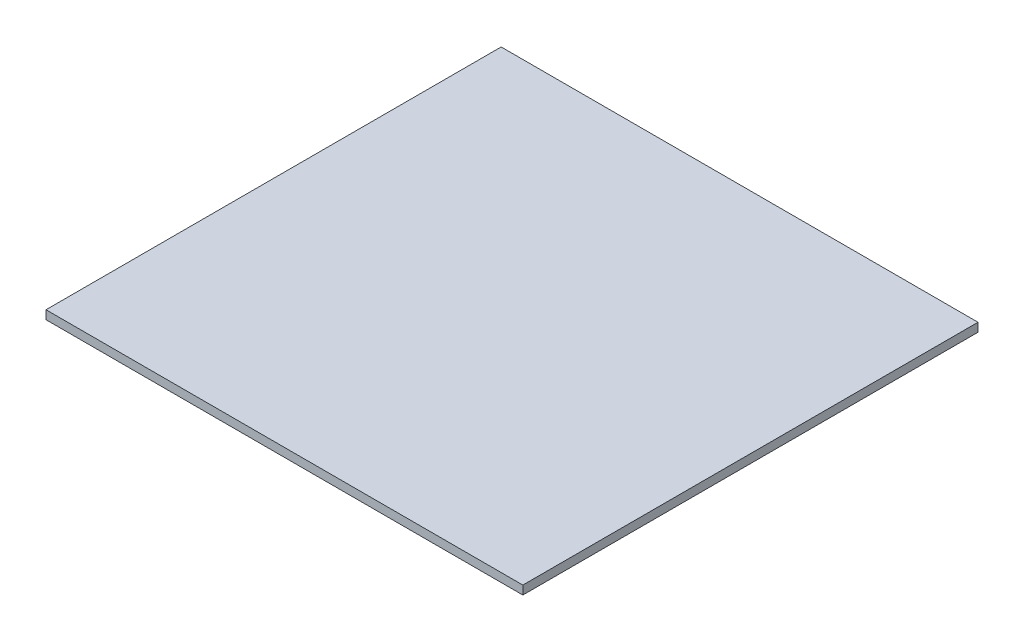
ISO-10303-21;
HEADER;
FILE_DESCRIPTION(('STEP AP214'),'2;1');
FILE_NAME('part.step','',(''),(''),'','','');
FILE_SCHEMA(('AUTOMOTIVE_DESIGN { 1 0 10303 214 1 1 1 1 }'));
ENDSEC;
DATA;
#1=APPLICATION_CONTEXT('core data for automotive mechanical design processes');
#2=APPLICATION_PROTOCOL_DEFINITION('international standard','automotive_design',2000,#1);
#3=PRODUCT_CONTEXT('',#1,'mechanical');
#4=PRODUCT('Part','Part','',(#3));
#5=PRODUCT_RELATED_PRODUCT_CATEGORY('part','',(#4));
#6=PRODUCT_DEFINITION_FORMATION('','',#4);
#7=PRODUCT_DEFINITION_CONTEXT('part definition',#1,'design');
#8=PRODUCT_DEFINITION('design','',#6,#7);
#9=PRODUCT_DEFINITION_SHAPE('','',#8);
#10=(LENGTH_UNIT() NAMED_UNIT(*) SI_UNIT(.MILLI.,.METRE.));
#11=(NAMED_UNIT(*) PLANE_ANGLE_UNIT() SI_UNIT($,.RADIAN.));
#12=(NAMED_UNIT(*) SI_UNIT($,.STERADIAN.) SOLID_ANGLE_UNIT());
#13=UNCERTAINTY_MEASURE_WITH_UNIT(LENGTH_MEASURE(1.E-05),#10,'distance_accuracy_value','');
#14=(GEOMETRIC_REPRESENTATION_CONTEXT(3) GLOBAL_UNCERTAINTY_ASSIGNED_CONTEXT((#13)) GLOBAL_UNIT_ASSIGNED_CONTEXT((#10,
#11,#12)) REPRESENTATION_CONTEXT('',''));
#15=CARTESIAN_POINT('',(0.,0.,0.));
#16=DIRECTION('',(0.,0.,1.));
#17=DIRECTION('',(1.,0.,0.));
#18=AXIS2_PLACEMENT_3D('',#15,#16,#17);
#19=CARTESIAN_POINT('',(-58.4225331348375,-20.,-39.8335453192074));
#20=DIRECTION('',(-1.,0.,0.));
#21=DIRECTION('',(0.,0.,1.));
#22=AXIS2_PLACEMENT_3D('',#19,#20,#21);
#23=PLANE('',#22);
#24=DIRECTION('',(0.,0.,1.));
#25=VECTOR('',#24,1.);
#26=CARTESIAN_POINT('',(-58.4225331348375,0.,-39.8335453192074));
#27=LINE('',#26,#25);
#28=CARTESIAN_POINT('',(-58.4225331348375,0.,-39.8335453192074));
#29=VERTEX_POINT('',#28);
#30=CARTESIAN_POINT('',(-58.4225331348373,0.,1010.16645468079));
#31=VERTEX_POINT('',#30);
#32=EDGE_CURVE('E98',#29,#31,#27,.T.);
#33=ORIENTED_EDGE('',*,*,#32,.F.);
#34=DIRECTION('',(0.,1.,0.));
#35=VECTOR('',#34,1.);
#36=CARTESIAN_POINT('',(-58.4225331348375,-20.,-39.8335453192074));
#37=LINE('',#36,#35);
#38=CARTESIAN_POINT('',(-58.4225331348375,-20.,-39.8335453192074));
#39=VERTEX_POINT('',#38);
#40=EDGE_CURVE('E11',#39,#29,#37,.T.);
#41=ORIENTED_EDGE('',*,*,#40,.F.);
#42=DIRECTION('',(0.,0.,1.));
#43=VECTOR('',#42,1.);
#44=CARTESIAN_POINT('',(-58.4225331348375,-20.,-39.8335453192074));
#45=LINE('',#44,#43);
#46=CARTESIAN_POINT('',(-58.4225331348373,-20.,1010.16645468079));
#47=VERTEX_POINT('',#46);
#48=EDGE_CURVE('E92',#39,#47,#45,.T.);
#49=ORIENTED_EDGE('',*,*,#48,.T.);
#50=DIRECTION('',(0.,1.,0.));
#51=VECTOR('',#50,1.);
#52=CARTESIAN_POINT('',(-58.4225331348373,-20.,1010.16645468079));
#53=LINE('',#52,#51);
#54=EDGE_CURVE('E37',#47,#31,#53,.T.);
#55=ORIENTED_EDGE('',*,*,#54,.T.);
#56=EDGE_LOOP('',(#33,#41,#49,#55));
#57=FACE_BOUND('',#56,.T.);
#58=ADVANCED_FACE('F34',(#57),#23,.T.);
#59=CARTESIAN_POINT('',(-58.4225331348375,-20.,-39.8335453192074));
#60=DIRECTION('',(0.,0.,-1.));
#61=DIRECTION('',(-1.,0.,0.));
#62=AXIS2_PLACEMENT_3D('',#59,#60,#61);
#63=PLANE('',#62);
#64=DIRECTION('',(-1.,0.,0.));
#65=VECTOR('',#64,1.);
#66=CARTESIAN_POINT('',(-58.4225331348375,0.,-39.8335453192074));
#67=LINE('',#66,#65);
#68=CARTESIAN_POINT('',(1041.57746686516,0.,-39.8335453192074));
#69=VERTEX_POINT('',#68);
#70=EDGE_CURVE('E94',#69,#29,#67,.T.);
#71=ORIENTED_EDGE('',*,*,#70,.F.);
#72=DIRECTION('',(0.,1.,0.));
#73=VECTOR('',#72,1.);
#74=CARTESIAN_POINT('',(1041.57746686516,-20.,-39.8335453192074));
#75=LINE('',#74,#73);
#76=CARTESIAN_POINT('',(1041.57746686516,-20.,-39.8335453192074));
#77=VERTEX_POINT('',#76);
#78=EDGE_CURVE('E43',#77,#69,#75,.T.);
#79=ORIENTED_EDGE('',*,*,#78,.F.);
#80=DIRECTION('',(-1.,0.,0.));
#81=VECTOR('',#80,1.);
#82=CARTESIAN_POINT('',(-58.4225331348375,-20.,-39.8335453192074));
#83=LINE('',#82,#81);
#84=EDGE_CURVE('E89',#77,#39,#83,.T.);
#85=ORIENTED_EDGE('',*,*,#84,.T.);
#86=ORIENTED_EDGE('',*,*,#40,.T.);
#87=EDGE_LOOP('',(#71,#79,#85,#86));
#88=FACE_BOUND('',#87,.T.);
#89=ADVANCED_FACE('F108',(#88),#63,.T.);
#90=CARTESIAN_POINT('',(1041.57746686516,-20.,-39.8335453192074));
#91=DIRECTION('',(1.,0.,0.));
#92=DIRECTION('',(0.,0.,-1.));
#93=AXIS2_PLACEMENT_3D('',#90,#91,#92);
#94=PLANE('',#93);
#95=DIRECTION('',(0.,0.,-1.));
#96=VECTOR('',#95,1.);
#97=CARTESIAN_POINT('',(1041.57746686516,0.,-39.8335453192074));
#98=LINE('',#97,#96);
#99=CARTESIAN_POINT('',(1041.57746686516,0.,1010.16645468079));
#100=VERTEX_POINT('',#99);
#101=EDGE_CURVE('E84',#100,#69,#98,.T.);
#102=ORIENTED_EDGE('',*,*,#101,.F.);
#103=DIRECTION('',(0.,1.,0.));
#104=VECTOR('',#103,1.);
#105=CARTESIAN_POINT('',(1041.57746686516,-20.,1010.16645468079));
#106=LINE('',#105,#104);
#107=CARTESIAN_POINT('',(1041.57746686516,-20.,1010.16645468079));
#108=VERTEX_POINT('',#107);
#109=EDGE_CURVE('E79',#108,#100,#106,.T.);
#110=ORIENTED_EDGE('',*,*,#109,.F.);
#111=DIRECTION('',(0.,0.,-1.));
#112=VECTOR('',#111,1.);
#113=CARTESIAN_POINT('',(1041.57746686516,-20.,-39.8335453192074));
#114=LINE('',#113,#112);
#115=EDGE_CURVE('E82',#108,#77,#114,.T.);
#116=ORIENTED_EDGE('',*,*,#115,.T.);
#117=ORIENTED_EDGE('',*,*,#78,.T.);
#118=EDGE_LOOP('',(#102,#110,#116,#117));
#119=FACE_BOUND('',#118,.T.);
#120=ADVANCED_FACE('F81',(#119),#94,.T.);
#121=CARTESIAN_POINT('',(-58.4225331348373,-20.,1010.16645468079));
#122=DIRECTION('',(0.,0.,1.));
#123=DIRECTION('',(1.,0.,0.));
#124=AXIS2_PLACEMENT_3D('',#121,#122,#123);
#125=PLANE('',#124);
#126=DIRECTION('',(1.,0.,0.));
#127=VECTOR('',#126,1.);
#128=CARTESIAN_POINT('',(-58.4225331348373,0.,1010.16645468079));
#129=LINE('',#128,#127);
#130=EDGE_CURVE('E101',#31,#100,#129,.T.);
#131=ORIENTED_EDGE('',*,*,#130,.F.);
#132=ORIENTED_EDGE('',*,*,#54,.F.);
#133=DIRECTION('',(1.,0.,0.));
#134=VECTOR('',#133,1.);
#135=CARTESIAN_POINT('',(-58.4225331348373,-20.,1010.16645468079));
#136=LINE('',#135,#134);
#137=EDGE_CURVE('E88',#47,#108,#136,.T.);
#138=ORIENTED_EDGE('',*,*,#137,.T.);
#139=ORIENTED_EDGE('',*,*,#109,.T.);
#140=EDGE_LOOP('',(#131,#132,#138,#139));
#141=FACE_BOUND('',#140,.T.);
#142=ADVANCED_FACE('F91',(#141),#125,.T.);
#143=CARTESIAN_POINT('',(0.,-20.,0.));
#144=DIRECTION('',(0.,1.,0.));
#145=DIRECTION('',(0.,0.,1.));
#146=AXIS2_PLACEMENT_3D('',#143,#144,#145);
#147=PLANE('',#146);
#148=ORIENTED_EDGE('',*,*,#48,.F.);
#149=ORIENTED_EDGE('',*,*,#84,.F.);
#150=ORIENTED_EDGE('',*,*,#115,.F.);
#151=ORIENTED_EDGE('',*,*,#137,.F.);
#152=EDGE_LOOP('',(#148,#149,#150,#151));
#153=FACE_BOUND('',#152,.T.);
#154=ADVANCED_FACE('F87',(#153),#147,.F.);
#155=CARTESIAN_POINT('',(0.,0.,0.));
#156=DIRECTION('',(0.,1.,0.));
#157=DIRECTION('',(0.,0.,1.));
#158=AXIS2_PLACEMENT_3D('',#155,#156,#157);
#159=PLANE('',#158);
#160=ORIENTED_EDGE('',*,*,#32,.T.);
#161=ORIENTED_EDGE('',*,*,#130,.T.);
#162=ORIENTED_EDGE('',*,*,#101,.T.);
#163=ORIENTED_EDGE('',*,*,#70,.T.);
#164=EDGE_LOOP('',(#160,#161,#162,#163));
#165=FACE_BOUND('',#164,.T.);
#166=ADVANCED_FACE('F107',(#165),#159,.T.);
#167=CLOSED_SHELL('',(#58,#89,#120,#142,#154,#166));
#168=MANIFOLD_SOLID_BREP('B2',#167);
#169=ADVANCED_BREP_SHAPE_REPRESENTATION('',(#18,#168),#14);
#170=SHAPE_DEFINITION_REPRESENTATION(#9,#169);
ENDSEC;
END-ISO-10303-21;
